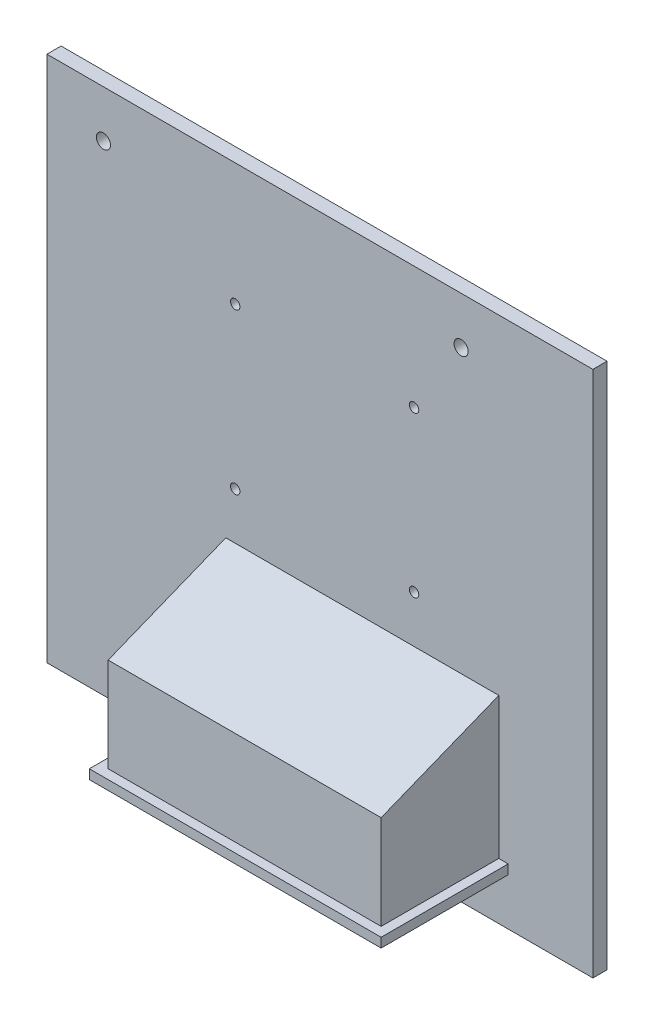
ISO-10303-21;
HEADER;
FILE_DESCRIPTION(('STEP AP214'),'2;1');
FILE_NAME('part.step','',(''),(''),'','','');
FILE_SCHEMA(('AUTOMOTIVE_DESIGN { 1 0 10303 214 1 1 1 1 }'));
ENDSEC;
DATA;
#1=APPLICATION_CONTEXT('core data for automotive mechanical design processes');
#2=APPLICATION_PROTOCOL_DEFINITION('international standard','automotive_design',2000,#1);
#3=PRODUCT_CONTEXT('',#1,'mechanical');
#4=PRODUCT('Part','Part','',(#3));
#5=PRODUCT_RELATED_PRODUCT_CATEGORY('part','',(#4));
#6=PRODUCT_DEFINITION_FORMATION('','',#4);
#7=PRODUCT_DEFINITION_CONTEXT('part definition',#1,'design');
#8=PRODUCT_DEFINITION('design','',#6,#7);
#9=PRODUCT_DEFINITION_SHAPE('','',#8);
#10=(LENGTH_UNIT() NAMED_UNIT(*) SI_UNIT(.MILLI.,.METRE.));
#11=(NAMED_UNIT(*) PLANE_ANGLE_UNIT() SI_UNIT($,.RADIAN.));
#12=(NAMED_UNIT(*) SI_UNIT($,.STERADIAN.) SOLID_ANGLE_UNIT());
#13=UNCERTAINTY_MEASURE_WITH_UNIT(LENGTH_MEASURE(1.E-05),#10,'distance_accuracy_value','');
#14=(GEOMETRIC_REPRESENTATION_CONTEXT(3) GLOBAL_UNCERTAINTY_ASSIGNED_CONTEXT((#13)) GLOBAL_UNIT_ASSIGNED_CONTEXT((#10,
#11,#12)) REPRESENTATION_CONTEXT('',''));
#15=CARTESIAN_POINT('',(0.,0.,0.));
#16=DIRECTION('',(0.,0.,1.));
#17=DIRECTION('',(1.,0.,0.));
#18=AXIS2_PLACEMENT_3D('',#15,#16,#17);
#19=CARTESIAN_POINT('',(0.,0.,3.));
#20=DIRECTION('',(0.,0.,-1.));
#21=DIRECTION('',(-1.,0.,0.));
#22=AXIS2_PLACEMENT_3D('',#19,#20,#21);
#23=PLANE('',#22);
#24=CARTESIAN_POINT('',(-36.,-46.,3.));
#25=DIRECTION('',(0.,0.,1.));
#26=DIRECTION('',(1.,0.,0.));
#27=AXIS2_PLACEMENT_3D('',#24,#25,#26);
#28=CIRCLE('',#27,1.5);
#29=CARTESIAN_POINT('',(-34.5,-46.,3.));
#30=VERTEX_POINT('',#29);
#31=EDGE_CURVE('E306',#30,#30,#28,.T.);
#32=ORIENTED_EDGE('',*,*,#31,.F.);
#33=EDGE_LOOP('',(#32));
#34=FACE_BOUND('',#33,.T.);
#35=CARTESIAN_POINT('',(-18.,30.,3.));
#36=DIRECTION('',(0.,0.,1.));
#37=DIRECTION('',(1.,0.,0.));
#38=AXIS2_PLACEMENT_3D('',#35,#36,#37);
#39=CIRCLE('',#38,1.);
#40=CARTESIAN_POINT('',(-17.,30.,3.));
#41=VERTEX_POINT('',#40);
#42=EDGE_CURVE('E307',#41,#41,#39,.T.);
#43=ORIENTED_EDGE('',*,*,#42,.F.);
#44=EDGE_LOOP('',(#43));
#45=FACE_BOUND('',#44,.T.);
#46=CARTESIAN_POINT('',(-18.,-4.,3.));
#47=DIRECTION('',(0.,0.,1.));
#48=DIRECTION('',(1.,0.,0.));
#49=AXIS2_PLACEMENT_3D('',#46,#47,#48);
#50=CIRCLE('',#49,1.);
#51=CARTESIAN_POINT('',(-17.,-4.,3.));
#52=VERTEX_POINT('',#51);
#53=EDGE_CURVE('E313',#52,#52,#50,.T.);
#54=ORIENTED_EDGE('',*,*,#53,.F.);
#55=EDGE_LOOP('',(#54));
#56=FACE_BOUND('',#55,.T.);
#57=CARTESIAN_POINT('',(20.,-4.,3.));
#58=DIRECTION('',(0.,0.,1.));
#59=DIRECTION('',(1.,0.,0.));
#60=AXIS2_PLACEMENT_3D('',#57,#58,#59);
#61=CIRCLE('',#60,1.);
#62=CARTESIAN_POINT('',(21.,-4.,3.));
#63=VERTEX_POINT('',#62);
#64=EDGE_CURVE('E281',#63,#63,#61,.T.);
#65=ORIENTED_EDGE('',*,*,#64,.F.);
#66=EDGE_LOOP('',(#65));
#67=FACE_BOUND('',#66,.T.);
#68=CARTESIAN_POINT('',(20.,30.,3.));
#69=DIRECTION('',(0.,0.,1.));
#70=DIRECTION('',(1.,0.,0.));
#71=AXIS2_PLACEMENT_3D('',#68,#69,#70);
#72=CIRCLE('',#71,1.);
#73=CARTESIAN_POINT('',(21.,30.,3.));
#74=VERTEX_POINT('',#73);
#75=EDGE_CURVE('E288',#74,#74,#72,.T.);
#76=ORIENTED_EDGE('',*,*,#75,.F.);
#77=EDGE_LOOP('',(#76));
#78=FACE_BOUND('',#77,.T.);
#79=CARTESIAN_POINT('',(30.,46.,3.));
#80=DIRECTION('',(0.,0.,1.));
#81=DIRECTION('',(1.,0.,0.));
#82=AXIS2_PLACEMENT_3D('',#79,#80,#81);
#83=CIRCLE('',#82,1.5);
#84=CARTESIAN_POINT('',(31.5,46.,3.));
#85=VERTEX_POINT('',#84);
#86=EDGE_CURVE('E294',#85,#85,#83,.T.);
#87=ORIENTED_EDGE('',*,*,#86,.F.);
#88=EDGE_LOOP('',(#87));
#89=FACE_BOUND('',#88,.T.);
#90=CARTESIAN_POINT('',(-46.,46.,3.));
#91=DIRECTION('',(0.,0.,1.));
#92=DIRECTION('',(1.,0.,0.));
#93=AXIS2_PLACEMENT_3D('',#90,#91,#92);
#94=CIRCLE('',#93,1.5);
#95=CARTESIAN_POINT('',(-44.5,46.,3.));
#96=VERTEX_POINT('',#95);
#97=EDGE_CURVE('E300',#96,#96,#94,.T.);
#98=ORIENTED_EDGE('',*,*,#97,.F.);
#99=EDGE_LOOP('',(#98));
#100=FACE_BOUND('',#99,.T.);
#101=DIRECTION('',(0.,-1.,0.));
#102=VECTOR('',#101,1.);
#103=CARTESIAN_POINT('',(-58.,-56.,3.));
#104=LINE('',#103,#102);
#105=CARTESIAN_POINT('',(-58.,56.,3.));
#106=VERTEX_POINT('',#105);
#107=CARTESIAN_POINT('',(-58.,-56.,3.));
#108=VERTEX_POINT('',#107);
#109=EDGE_CURVE('E202',#106,#108,#104,.T.);
#110=ORIENTED_EDGE('',*,*,#109,.T.);
#111=DIRECTION('',(1.,0.,0.));
#112=VECTOR('',#111,1.);
#113=CARTESIAN_POINT('',(-58.,-56.,3.));
#114=LINE('',#113,#112);
#115=CARTESIAN_POINT('',(58.,-56.,3.));
#116=VERTEX_POINT('',#115);
#117=EDGE_CURVE('E204',#108,#116,#114,.T.);
#118=ORIENTED_EDGE('',*,*,#117,.T.);
#119=DIRECTION('',(0.,1.,0.));
#120=VECTOR('',#119,1.);
#121=CARTESIAN_POINT('',(58.,-56.,3.));
#122=LINE('',#121,#120);
#123=CARTESIAN_POINT('',(58.,56.,3.));
#124=VERTEX_POINT('',#123);
#125=EDGE_CURVE('E196',#116,#124,#122,.T.);
#126=ORIENTED_EDGE('',*,*,#125,.T.);
#127=DIRECTION('',(-1.,0.,0.));
#128=VECTOR('',#127,1.);
#129=CARTESIAN_POINT('',(-58.,56.,3.));
#130=LINE('',#129,#128);
#131=EDGE_CURVE('E199',#124,#106,#130,.T.);
#132=ORIENTED_EDGE('',*,*,#131,.T.);
#133=EDGE_LOOP('',(#110,#118,#126,#132));
#134=FACE_BOUND('',#133,.T.);
#135=DIRECTION('',(1.,0.,0.));
#136=VECTOR('',#135,1.);
#137=CARTESIAN_POINT('',(-22.,-44.,3.));
#138=LINE('',#137,#136);
#139=CARTESIAN_POINT('',(38.,-44.,3.));
#140=VERTEX_POINT('',#139);
#141=CARTESIAN_POINT('',(40.,-44.,3.));
#142=VERTEX_POINT('',#141);
#143=EDGE_CURVE('E259',#140,#142,#138,.T.);
#144=ORIENTED_EDGE('',*,*,#143,.T.);
#145=DIRECTION('',(0.,-1.,0.));
#146=VECTOR('',#145,1.);
#147=CARTESIAN_POINT('',(40.,-44.,3.));
#148=LINE('',#147,#146);
#149=CARTESIAN_POINT('',(40.,-46.,3.));
#150=VERTEX_POINT('',#149);
#151=EDGE_CURVE('E247',#142,#150,#148,.T.);
#152=ORIENTED_EDGE('',*,*,#151,.T.);
#153=DIRECTION('',(1.,0.,0.));
#154=VECTOR('',#153,1.);
#155=CARTESIAN_POINT('',(-22.,-46.,3.));
#156=LINE('',#155,#154);
#157=CARTESIAN_POINT('',(38.,-46.,3.));
#158=VERTEX_POINT('',#157);
#159=EDGE_CURVE('E268',#158,#150,#156,.T.);
#160=ORIENTED_EDGE('',*,*,#159,.F.);
#161=DIRECTION('',(0.,1.,0.));
#162=VECTOR('',#161,1.);
#163=CARTESIAN_POINT('',(38.,-48.,3.));
#164=LINE('',#163,#162);
#165=CARTESIAN_POINT('',(38.,-48.,3.));
#166=VERTEX_POINT('',#165);
#167=EDGE_CURVE('E182',#166,#158,#164,.T.);
#168=ORIENTED_EDGE('',*,*,#167,.F.);
#169=DIRECTION('',(1.,0.,0.));
#170=VECTOR('',#169,1.);
#171=CARTESIAN_POINT('',(-20.,-48.,3.));
#172=LINE('',#171,#170);
#173=CARTESIAN_POINT('',(-20.,-48.,3.));
#174=VERTEX_POINT('',#173);
#175=EDGE_CURVE('E166',#174,#166,#172,.T.);
#176=ORIENTED_EDGE('',*,*,#175,.F.);
#177=DIRECTION('',(0.,-1.,0.));
#178=VECTOR('',#177,1.);
#179=CARTESIAN_POINT('',(-20.,-48.,3.));
#180=LINE('',#179,#178);
#181=CARTESIAN_POINT('',(-20.,-46.,3.));
#182=VERTEX_POINT('',#181);
#183=EDGE_CURVE('E187',#182,#174,#180,.T.);
#184=ORIENTED_EDGE('',*,*,#183,.F.);
#185=CARTESIAN_POINT('',(-22.,-46.,3.));
#186=VERTEX_POINT('',#185);
#187=EDGE_CURVE('E266',#186,#182,#156,.T.);
#188=ORIENTED_EDGE('',*,*,#187,.F.);
#189=DIRECTION('',(0.,-1.,0.));
#190=VECTOR('',#189,1.);
#191=CARTESIAN_POINT('',(-22.,-44.,3.));
#192=LINE('',#191,#190);
#193=CARTESIAN_POINT('',(-22.,-44.,3.));
#194=VERTEX_POINT('',#193);
#195=EDGE_CURVE('E244',#194,#186,#192,.T.);
#196=ORIENTED_EDGE('',*,*,#195,.F.);
#197=CARTESIAN_POINT('',(-20.,-44.,3.));
#198=VERTEX_POINT('',#197);
#199=EDGE_CURVE('E277',#194,#198,#138,.T.);
#200=ORIENTED_EDGE('',*,*,#199,.T.);
#201=CARTESIAN_POINT('',(-20.,-14.,3.));
#202=VERTEX_POINT('',#201);
#203=EDGE_CURVE('E171',#202,#198,#180,.T.);
#204=ORIENTED_EDGE('',*,*,#203,.F.);
#205=DIRECTION('',(-1.,0.,0.));
#206=VECTOR('',#205,1.);
#207=CARTESIAN_POINT('',(-20.,-14.,3.));
#208=LINE('',#207,#206);
#209=CARTESIAN_POINT('',(38.,-14.,3.));
#210=VERTEX_POINT('',#209);
#211=EDGE_CURVE('E185',#210,#202,#208,.T.);
#212=ORIENTED_EDGE('',*,*,#211,.F.);
#213=EDGE_CURVE('E159',#140,#210,#164,.T.);
#214=ORIENTED_EDGE('',*,*,#213,.F.);
#215=EDGE_LOOP('',(#144,#152,#160,#168,#176,#184,#188,#196,#200,#204,#212,#214));
#216=FACE_BOUND('',#215,.T.);
#217=ADVANCED_FACE('F34',(#34,#45,#56,#67,#78,#89,#100,#134,#216),#23,.F.);
#218=CARTESIAN_POINT('',(38.,-48.,28.));
#219=DIRECTION('',(-1.,0.,0.));
#220=DIRECTION('',(0.,0.,1.));
#221=AXIS2_PLACEMENT_3D('',#218,#219,#220);
#222=PLANE('',#221);
#223=ORIENTED_EDGE('',*,*,#213,.T.);
#224=DIRECTION('',(0.,0.371405845234205,-0.928470623189482));
#225=VECTOR('',#224,1.);
#226=CARTESIAN_POINT('',(38.,-14.,3.));
#227=LINE('',#226,#225);
#228=CARTESIAN_POINT('',(38.,-24.0004737887762,28.));
#229=VERTEX_POINT('',#228);
#230=EDGE_CURVE('E57',#229,#210,#227,.T.);
#231=ORIENTED_EDGE('',*,*,#230,.F.);
#232=DIRECTION('',(0.,1.,0.));
#233=VECTOR('',#232,1.);
#234=CARTESIAN_POINT('',(38.,-48.,28.));
#235=LINE('',#234,#233);
#236=CARTESIAN_POINT('',(38.,-44.,28.));
#237=VERTEX_POINT('',#236);
#238=EDGE_CURVE('E157',#237,#229,#235,.T.);
#239=ORIENTED_EDGE('',*,*,#238,.F.);
#240=DIRECTION('',(0.,0.,1.));
#241=VECTOR('',#240,1.);
#242=CARTESIAN_POINT('',(38.,-44.,28.));
#243=LINE('',#242,#241);
#244=EDGE_CURVE('E175',#140,#237,#243,.T.);
#245=ORIENTED_EDGE('',*,*,#244,.F.);
#246=EDGE_LOOP('',(#223,#231,#239,#245));
#247=FACE_BOUND('',#246,.T.);
#248=ADVANCED_FACE('F155',(#247),#222,.F.);
#249=CARTESIAN_POINT('',(-20.,-48.,28.));
#250=DIRECTION('',(1.,0.,0.));
#251=DIRECTION('',(0.,0.,-1.));
#252=AXIS2_PLACEMENT_3D('',#249,#250,#251);
#253=PLANE('',#252);
#254=DIRECTION('',(0.,-1.,0.));
#255=VECTOR('',#254,1.);
#256=CARTESIAN_POINT('',(-20.,-48.,28.));
#257=LINE('',#256,#255);
#258=CARTESIAN_POINT('',(-20.,-24.0004737887762,28.));
#259=VERTEX_POINT('',#258);
#260=CARTESIAN_POINT('',(-20.,-44.,28.));
#261=VERTEX_POINT('',#260);
#262=EDGE_CURVE('E177',#259,#261,#257,.T.);
#263=ORIENTED_EDGE('',*,*,#262,.F.);
#264=DIRECTION('',(0.,0.371405845234205,-0.928470623189483));
#265=VECTOR('',#264,1.);
#266=CARTESIAN_POINT('',(-20.,-27.311023678241,36.2759826168945));
#267=LINE('',#266,#265);
#268=EDGE_CURVE('E148',#259,#202,#267,.T.);
#269=ORIENTED_EDGE('',*,*,#268,.T.);
#270=ORIENTED_EDGE('',*,*,#203,.T.);
#271=DIRECTION('',(0.,0.,-1.));
#272=VECTOR('',#271,1.);
#273=CARTESIAN_POINT('',(-20.,-44.,28.));
#274=LINE('',#273,#272);
#275=EDGE_CURVE('E242',#261,#198,#274,.T.);
#276=ORIENTED_EDGE('',*,*,#275,.F.);
#277=EDGE_LOOP('',(#263,#269,#270,#276));
#278=FACE_BOUND('',#277,.T.);
#279=ADVANCED_FACE('F370',(#278),#253,.F.);
#280=CARTESIAN_POINT('',(0.,0.,28.));
#281=DIRECTION('',(0.,0.,-1.));
#282=DIRECTION('',(-1.,0.,0.));
#283=AXIS2_PLACEMENT_3D('',#280,#281,#282);
#284=PLANE('',#283);
#285=ORIENTED_EDGE('',*,*,#238,.T.);
#286=DIRECTION('',(1.,0.,0.));
#287=VECTOR('',#286,1.);
#288=CARTESIAN_POINT('',(-58.,-24.0004737887762,28.));
#289=LINE('',#288,#287);
#290=EDGE_CURVE('E145',#259,#229,#289,.T.);
#291=ORIENTED_EDGE('',*,*,#290,.F.);
#292=ORIENTED_EDGE('',*,*,#262,.T.);
#293=DIRECTION('',(-1.,0.,0.));
#294=VECTOR('',#293,1.);
#295=CARTESIAN_POINT('',(0.,-44.,28.));
#296=LINE('',#295,#294);
#297=EDGE_CURVE('E11',#237,#261,#296,.T.);
#298=ORIENTED_EDGE('',*,*,#297,.F.);
#299=EDGE_LOOP('',(#285,#291,#292,#298));
#300=FACE_BOUND('',#299,.T.);
#301=ADVANCED_FACE('F164',(#300),#284,.F.);
#302=CARTESIAN_POINT('',(58.,-56.,3.));
#303=DIRECTION('',(-1.,0.,0.));
#304=DIRECTION('',(0.,0.,1.));
#305=AXIS2_PLACEMENT_3D('',#302,#303,#304);
#306=PLANE('',#305);
#307=DIRECTION('',(0.,1.,0.));
#308=VECTOR('',#307,1.);
#309=CARTESIAN_POINT('',(58.,-56.,0.));
#310=LINE('',#309,#308);
#311=CARTESIAN_POINT('',(58.,-56.,0.));
#312=VERTEX_POINT('',#311);
#313=CARTESIAN_POINT('',(58.,56.,0.));
#314=VERTEX_POINT('',#313);
#315=EDGE_CURVE('E195',#312,#314,#310,.T.);
#316=ORIENTED_EDGE('',*,*,#315,.T.);
#317=DIRECTION('',(0.,0.,-1.));
#318=VECTOR('',#317,1.);
#319=CARTESIAN_POINT('',(58.,56.,3.));
#320=LINE('',#319,#318);
#321=EDGE_CURVE('E222',#124,#314,#320,.T.);
#322=ORIENTED_EDGE('',*,*,#321,.F.);
#323=ORIENTED_EDGE('',*,*,#125,.F.);
#324=DIRECTION('',(0.,0.,-1.));
#325=VECTOR('',#324,1.);
#326=CARTESIAN_POINT('',(58.,-56.,3.));
#327=LINE('',#326,#325);
#328=EDGE_CURVE('E206',#116,#312,#327,.T.);
#329=ORIENTED_EDGE('',*,*,#328,.T.);
#330=EDGE_LOOP('',(#316,#322,#323,#329));
#331=FACE_BOUND('',#330,.T.);
#332=ADVANCED_FACE('F36',(#331),#306,.F.);
#333=CARTESIAN_POINT('',(-58.,56.,3.));
#334=DIRECTION('',(0.,-1.,0.));
#335=DIRECTION('',(0.,0.,-1.));
#336=AXIS2_PLACEMENT_3D('',#333,#334,#335);
#337=PLANE('',#336);
#338=DIRECTION('',(-1.,0.,0.));
#339=VECTOR('',#338,1.);
#340=CARTESIAN_POINT('',(-58.,56.,0.));
#341=LINE('',#340,#339);
#342=CARTESIAN_POINT('',(-58.,56.,0.));
#343=VERTEX_POINT('',#342);
#344=EDGE_CURVE('E209',#314,#343,#341,.T.);
#345=ORIENTED_EDGE('',*,*,#344,.T.);
#346=DIRECTION('',(0.,0.,-1.));
#347=VECTOR('',#346,1.);
#348=CARTESIAN_POINT('',(-58.,56.,3.));
#349=LINE('',#348,#347);
#350=EDGE_CURVE('E219',#106,#343,#349,.T.);
#351=ORIENTED_EDGE('',*,*,#350,.F.);
#352=ORIENTED_EDGE('',*,*,#131,.F.);
#353=ORIENTED_EDGE('',*,*,#321,.T.);
#354=EDGE_LOOP('',(#345,#351,#352,#353));
#355=FACE_BOUND('',#354,.T.);
#356=ADVANCED_FACE('F396',(#355),#337,.F.);
#357=CARTESIAN_POINT('',(-58.,-56.,3.));
#358=DIRECTION('',(1.,0.,0.));
#359=DIRECTION('',(0.,0.,-1.));
#360=AXIS2_PLACEMENT_3D('',#357,#358,#359);
#361=PLANE('',#360);
#362=DIRECTION('',(0.,-1.,0.));
#363=VECTOR('',#362,1.);
#364=CARTESIAN_POINT('',(-58.,-56.,0.));
#365=LINE('',#364,#363);
#366=CARTESIAN_POINT('',(-58.,-56.,0.));
#367=VERTEX_POINT('',#366);
#368=EDGE_CURVE('E211',#343,#367,#365,.T.);
#369=ORIENTED_EDGE('',*,*,#368,.T.);
#370=DIRECTION('',(0.,0.,-1.));
#371=VECTOR('',#370,1.);
#372=CARTESIAN_POINT('',(-58.,-56.,3.));
#373=LINE('',#372,#371);
#374=EDGE_CURVE('E216',#108,#367,#373,.T.);
#375=ORIENTED_EDGE('',*,*,#374,.F.);
#376=ORIENTED_EDGE('',*,*,#109,.F.);
#377=ORIENTED_EDGE('',*,*,#350,.T.);
#378=EDGE_LOOP('',(#369,#375,#376,#377));
#379=FACE_BOUND('',#378,.T.);
#380=ADVANCED_FACE('F393',(#379),#361,.F.);
#381=CARTESIAN_POINT('',(-58.,-56.,3.));
#382=DIRECTION('',(0.,1.,0.));
#383=DIRECTION('',(0.,0.,1.));
#384=AXIS2_PLACEMENT_3D('',#381,#382,#383);
#385=PLANE('',#384);
#386=DIRECTION('',(1.,0.,0.));
#387=VECTOR('',#386,1.);
#388=CARTESIAN_POINT('',(-58.,-56.,0.));
#389=LINE('',#388,#387);
#390=EDGE_CURVE('E200',#367,#312,#389,.T.);
#391=ORIENTED_EDGE('',*,*,#390,.T.);
#392=ORIENTED_EDGE('',*,*,#328,.F.);
#393=ORIENTED_EDGE('',*,*,#117,.F.);
#394=ORIENTED_EDGE('',*,*,#374,.T.);
#395=EDGE_LOOP('',(#391,#392,#393,#394));
#396=FACE_BOUND('',#395,.T.);
#397=ADVANCED_FACE('F388',(#396),#385,.F.);
#398=CARTESIAN_POINT('',(0.,0.,0.));
#399=DIRECTION('',(0.,0.,-1.));
#400=DIRECTION('',(-1.,0.,0.));
#401=AXIS2_PLACEMENT_3D('',#398,#399,#400);
#402=PLANE('',#401);
#403=CARTESIAN_POINT('',(-36.,-46.,0.));
#404=DIRECTION('',(0.,0.,1.));
#405=DIRECTION('',(1.,0.,0.));
#406=AXIS2_PLACEMENT_3D('',#403,#404,#405);
#407=CIRCLE('',#406,1.5);
#408=CARTESIAN_POINT('',(-34.5,-46.,0.));
#409=VERTEX_POINT('',#408);
#410=EDGE_CURVE('E161',#409,#409,#407,.T.);
#411=ORIENTED_EDGE('',*,*,#410,.T.);
#412=EDGE_LOOP('',(#411));
#413=FACE_BOUND('',#412,.T.);
#414=CARTESIAN_POINT('',(-18.,30.,0.));
#415=DIRECTION('',(0.,0.,1.));
#416=DIRECTION('',(1.,0.,0.));
#417=AXIS2_PLACEMENT_3D('',#414,#415,#416);
#418=CIRCLE('',#417,1.);
#419=CARTESIAN_POINT('',(-17.,30.,0.));
#420=VERTEX_POINT('',#419);
#421=EDGE_CURVE('E310',#420,#420,#418,.T.);
#422=ORIENTED_EDGE('',*,*,#421,.T.);
#423=EDGE_LOOP('',(#422));
#424=FACE_BOUND('',#423,.T.);
#425=CARTESIAN_POINT('',(-18.,-4.,0.));
#426=DIRECTION('',(0.,0.,1.));
#427=DIRECTION('',(1.,0.,0.));
#428=AXIS2_PLACEMENT_3D('',#425,#426,#427);
#429=CIRCLE('',#428,1.);
#430=CARTESIAN_POINT('',(-17.,-4.,0.));
#431=VERTEX_POINT('',#430);
#432=EDGE_CURVE('E285',#431,#431,#429,.T.);
#433=ORIENTED_EDGE('',*,*,#432,.T.);
#434=EDGE_LOOP('',(#433));
#435=FACE_BOUND('',#434,.T.);
#436=CARTESIAN_POINT('',(20.,-4.,0.));
#437=DIRECTION('',(0.,0.,1.));
#438=DIRECTION('',(1.,0.,0.));
#439=AXIS2_PLACEMENT_3D('',#436,#437,#438);
#440=CIRCLE('',#439,1.);
#441=CARTESIAN_POINT('',(21.,-4.,0.));
#442=VERTEX_POINT('',#441);
#443=EDGE_CURVE('E284',#442,#442,#440,.T.);
#444=ORIENTED_EDGE('',*,*,#443,.T.);
#445=EDGE_LOOP('',(#444));
#446=FACE_BOUND('',#445,.T.);
#447=CARTESIAN_POINT('',(20.,30.,0.));
#448=DIRECTION('',(0.,0.,1.));
#449=DIRECTION('',(1.,0.,0.));
#450=AXIS2_PLACEMENT_3D('',#447,#448,#449);
#451=CIRCLE('',#450,1.);
#452=CARTESIAN_POINT('',(21.,30.,0.));
#453=VERTEX_POINT('',#452);
#454=EDGE_CURVE('E291',#453,#453,#451,.T.);
#455=ORIENTED_EDGE('',*,*,#454,.T.);
#456=EDGE_LOOP('',(#455));
#457=FACE_BOUND('',#456,.T.);
#458=CARTESIAN_POINT('',(30.,46.,0.));
#459=DIRECTION('',(0.,0.,1.));
#460=DIRECTION('',(1.,0.,0.));
#461=AXIS2_PLACEMENT_3D('',#458,#459,#460);
#462=CIRCLE('',#461,1.5);
#463=CARTESIAN_POINT('',(31.5,46.,0.));
#464=VERTEX_POINT('',#463);
#465=EDGE_CURVE('E297',#464,#464,#462,.T.);
#466=ORIENTED_EDGE('',*,*,#465,.T.);
#467=EDGE_LOOP('',(#466));
#468=FACE_BOUND('',#467,.T.);
#469=CARTESIAN_POINT('',(-46.,46.,0.));
#470=DIRECTION('',(0.,0.,1.));
#471=DIRECTION('',(1.,0.,0.));
#472=AXIS2_PLACEMENT_3D('',#469,#470,#471);
#473=CIRCLE('',#472,1.5);
#474=CARTESIAN_POINT('',(-44.5,46.,0.));
#475=VERTEX_POINT('',#474);
#476=EDGE_CURVE('E303',#475,#475,#473,.T.);
#477=ORIENTED_EDGE('',*,*,#476,.T.);
#478=EDGE_LOOP('',(#477));
#479=FACE_BOUND('',#478,.T.);
#480=ORIENTED_EDGE('',*,*,#315,.F.);
#481=ORIENTED_EDGE('',*,*,#390,.F.);
#482=ORIENTED_EDGE('',*,*,#368,.F.);
#483=ORIENTED_EDGE('',*,*,#344,.F.);
#484=EDGE_LOOP('',(#480,#481,#482,#483));
#485=FACE_BOUND('',#484,.T.);
#486=ADVANCED_FACE('F323',(#413,#424,#435,#446,#457,#468,#479,#485),#402,.T.);
#487=ORIENTED_EDGE('',*,*,#167,.T.);
#488=DIRECTION('',(0.,0.,1.));
#489=VECTOR('',#488,1.);
#490=CARTESIAN_POINT('',(38.,-46.,28.));
#491=LINE('',#490,#489);
#492=CARTESIAN_POINT('',(38.,-46.,28.));
#493=VERTEX_POINT('',#492);
#494=EDGE_CURVE('E240',#158,#493,#491,.T.);
#495=ORIENTED_EDGE('',*,*,#494,.T.);
#496=CARTESIAN_POINT('',(38.,-48.,28.));
#497=VERTEX_POINT('',#496);
#498=EDGE_CURVE('E165',#497,#493,#235,.T.);
#499=ORIENTED_EDGE('',*,*,#498,.F.);
#500=DIRECTION('',(0.,0.,-1.));
#501=VECTOR('',#500,1.);
#502=CARTESIAN_POINT('',(38.,-48.,28.));
#503=LINE('',#502,#501);
#504=EDGE_CURVE('E181',#497,#166,#503,.T.);
#505=ORIENTED_EDGE('',*,*,#504,.T.);
#506=EDGE_LOOP('',(#487,#495,#499,#505));
#507=FACE_BOUND('',#506,.T.);
#508=ADVANCED_FACE('F239',(#507),#222,.F.);
#509=CARTESIAN_POINT('',(-20.,-46.,28.));
#510=VERTEX_POINT('',#509);
#511=CARTESIAN_POINT('',(-20.,-48.,28.));
#512=VERTEX_POINT('',#511);
#513=EDGE_CURVE('E169',#510,#512,#257,.T.);
#514=ORIENTED_EDGE('',*,*,#513,.F.);
#515=DIRECTION('',(0.,0.,-1.));
#516=VECTOR('',#515,1.);
#517=CARTESIAN_POINT('',(-20.,-46.,28.));
#518=LINE('',#517,#516);
#519=EDGE_CURVE('E49',#510,#182,#518,.T.);
#520=ORIENTED_EDGE('',*,*,#519,.T.);
#521=ORIENTED_EDGE('',*,*,#183,.T.);
#522=DIRECTION('',(0.,0.,-1.));
#523=VECTOR('',#522,1.);
#524=CARTESIAN_POINT('',(-20.,-48.,28.));
#525=LINE('',#524,#523);
#526=EDGE_CURVE('E192',#512,#174,#525,.T.);
#527=ORIENTED_EDGE('',*,*,#526,.F.);
#528=EDGE_LOOP('',(#514,#520,#521,#527));
#529=FACE_BOUND('',#528,.T.);
#530=ADVANCED_FACE('F231',(#529),#253,.F.);
#531=CARTESIAN_POINT('',(-20.,-48.,28.));
#532=DIRECTION('',(0.,1.,0.));
#533=DIRECTION('',(0.,0.,1.));
#534=AXIS2_PLACEMENT_3D('',#531,#532,#533);
#535=PLANE('',#534);
#536=ORIENTED_EDGE('',*,*,#175,.T.);
#537=ORIENTED_EDGE('',*,*,#504,.F.);
#538=DIRECTION('',(1.,0.,0.));
#539=VECTOR('',#538,1.);
#540=CARTESIAN_POINT('',(-20.,-48.,28.));
#541=LINE('',#540,#539);
#542=EDGE_CURVE('E179',#512,#497,#541,.T.);
#543=ORIENTED_EDGE('',*,*,#542,.F.);
#544=ORIENTED_EDGE('',*,*,#526,.T.);
#545=EDGE_LOOP('',(#536,#537,#543,#544));
#546=FACE_BOUND('',#545,.T.);
#547=ADVANCED_FACE('F237',(#546),#535,.F.);
#548=ORIENTED_EDGE('',*,*,#498,.T.);
#549=DIRECTION('',(-1.,0.,0.));
#550=VECTOR('',#549,1.);
#551=CARTESIAN_POINT('',(0.,-46.,28.));
#552=LINE('',#551,#550);
#553=EDGE_CURVE('E42',#493,#510,#552,.T.);
#554=ORIENTED_EDGE('',*,*,#553,.T.);
#555=ORIENTED_EDGE('',*,*,#513,.T.);
#556=ORIENTED_EDGE('',*,*,#542,.T.);
#557=EDGE_LOOP('',(#548,#554,#555,#556));
#558=FACE_BOUND('',#557,.T.);
#559=ADVANCED_FACE('F226',(#558),#284,.F.);
#560=CARTESIAN_POINT('',(0.,-44.,0.));
#561=DIRECTION('',(0.,-1.,0.));
#562=DIRECTION('',(0.,0.,-1.));
#563=AXIS2_PLACEMENT_3D('',#560,#561,#562);
#564=PLANE('',#563);
#565=ORIENTED_EDGE('',*,*,#143,.F.);
#566=ORIENTED_EDGE('',*,*,#244,.T.);
#567=ORIENTED_EDGE('',*,*,#297,.T.);
#568=ORIENTED_EDGE('',*,*,#275,.T.);
#569=ORIENTED_EDGE('',*,*,#199,.F.);
#570=DIRECTION('',(0.,0.,-1.));
#571=VECTOR('',#570,1.);
#572=CARTESIAN_POINT('',(-22.,-44.,30.));
#573=LINE('',#572,#571);
#574=CARTESIAN_POINT('',(-22.,-44.,30.));
#575=VERTEX_POINT('',#574);
#576=EDGE_CURVE('E251',#575,#194,#573,.T.);
#577=ORIENTED_EDGE('',*,*,#576,.F.);
#578=DIRECTION('',(-1.,0.,0.));
#579=VECTOR('',#578,1.);
#580=CARTESIAN_POINT('',(40.,-44.,30.));
#581=LINE('',#580,#579);
#582=CARTESIAN_POINT('',(40.,-44.,30.));
#583=VERTEX_POINT('',#582);
#584=EDGE_CURVE('E271',#583,#575,#581,.T.);
#585=ORIENTED_EDGE('',*,*,#584,.F.);
#586=DIRECTION('',(0.,0.,1.));
#587=VECTOR('',#586,1.);
#588=CARTESIAN_POINT('',(40.,-44.,3.));
#589=LINE('',#588,#587);
#590=EDGE_CURVE('E274',#142,#583,#589,.T.);
#591=ORIENTED_EDGE('',*,*,#590,.F.);
#592=EDGE_LOOP('',(#565,#566,#567,#568,#569,#577,#585,#591));
#593=FACE_BOUND('',#592,.T.);
#594=ADVANCED_FACE('F354',(#593),#564,.F.);
#595=CARTESIAN_POINT('',(0.,-46.,0.));
#596=DIRECTION('',(0.,-1.,0.));
#597=DIRECTION('',(0.,0.,-1.));
#598=AXIS2_PLACEMENT_3D('',#595,#596,#597);
#599=PLANE('',#598);
#600=ORIENTED_EDGE('',*,*,#494,.F.);
#601=ORIENTED_EDGE('',*,*,#159,.T.);
#602=DIRECTION('',(0.,0.,1.));
#603=VECTOR('',#602,1.);
#604=CARTESIAN_POINT('',(40.,-46.,3.));
#605=LINE('',#604,#603);
#606=CARTESIAN_POINT('',(40.,-46.,30.));
#607=VERTEX_POINT('',#606);
#608=EDGE_CURVE('E263',#150,#607,#605,.T.);
#609=ORIENTED_EDGE('',*,*,#608,.T.);
#610=DIRECTION('',(-1.,0.,0.));
#611=VECTOR('',#610,1.);
#612=CARTESIAN_POINT('',(40.,-46.,30.));
#613=LINE('',#612,#611);
#614=CARTESIAN_POINT('',(-22.,-46.,30.));
#615=VERTEX_POINT('',#614);
#616=EDGE_CURVE('E260',#607,#615,#613,.T.);
#617=ORIENTED_EDGE('',*,*,#616,.T.);
#618=DIRECTION('',(0.,0.,-1.));
#619=VECTOR('',#618,1.);
#620=CARTESIAN_POINT('',(-22.,-46.,30.));
#621=LINE('',#620,#619);
#622=EDGE_CURVE('E256',#615,#186,#621,.T.);
#623=ORIENTED_EDGE('',*,*,#622,.T.);
#624=ORIENTED_EDGE('',*,*,#187,.T.);
#625=ORIENTED_EDGE('',*,*,#519,.F.);
#626=ORIENTED_EDGE('',*,*,#553,.F.);
#627=EDGE_LOOP('',(#600,#601,#609,#617,#623,#624,#625,#626));
#628=FACE_BOUND('',#627,.T.);
#629=ADVANCED_FACE('F361',(#628),#599,.T.);
#630=CARTESIAN_POINT('',(-22.,-44.,30.));
#631=DIRECTION('',(-1.,0.,0.));
#632=DIRECTION('',(0.,0.,1.));
#633=AXIS2_PLACEMENT_3D('',#630,#631,#632);
#634=PLANE('',#633);
#635=ORIENTED_EDGE('',*,*,#622,.F.);
#636=DIRECTION('',(0.,-1.,0.));
#637=VECTOR('',#636,1.);
#638=CARTESIAN_POINT('',(-22.,-44.,30.));
#639=LINE('',#638,#637);
#640=EDGE_CURVE('E253',#575,#615,#639,.T.);
#641=ORIENTED_EDGE('',*,*,#640,.F.);
#642=ORIENTED_EDGE('',*,*,#576,.T.);
#643=ORIENTED_EDGE('',*,*,#195,.T.);
#644=EDGE_LOOP('',(#635,#641,#642,#643));
#645=FACE_BOUND('',#644,.T.);
#646=ADVANCED_FACE('F366',(#645),#634,.T.);
#647=CARTESIAN_POINT('',(40.,-44.,30.));
#648=DIRECTION('',(0.,0.,1.));
#649=DIRECTION('',(1.,0.,0.));
#650=AXIS2_PLACEMENT_3D('',#647,#648,#649);
#651=PLANE('',#650);
#652=ORIENTED_EDGE('',*,*,#616,.F.);
#653=DIRECTION('',(0.,-1.,0.));
#654=VECTOR('',#653,1.);
#655=CARTESIAN_POINT('',(40.,-44.,30.));
#656=LINE('',#655,#654);
#657=EDGE_CURVE('E250',#583,#607,#656,.T.);
#658=ORIENTED_EDGE('',*,*,#657,.F.);
#659=ORIENTED_EDGE('',*,*,#584,.T.);
#660=ORIENTED_EDGE('',*,*,#640,.T.);
#661=EDGE_LOOP('',(#652,#658,#659,#660));
#662=FACE_BOUND('',#661,.T.);
#663=ADVANCED_FACE('F534',(#662),#651,.T.);
#664=CARTESIAN_POINT('',(40.,-44.,3.));
#665=DIRECTION('',(1.,0.,0.));
#666=DIRECTION('',(0.,0.,-1.));
#667=AXIS2_PLACEMENT_3D('',#664,#665,#666);
#668=PLANE('',#667);
#669=ORIENTED_EDGE('',*,*,#608,.F.);
#670=ORIENTED_EDGE('',*,*,#151,.F.);
#671=ORIENTED_EDGE('',*,*,#590,.T.);
#672=ORIENTED_EDGE('',*,*,#657,.T.);
#673=EDGE_LOOP('',(#669,#670,#671,#672));
#674=FACE_BOUND('',#673,.T.);
#675=ADVANCED_FACE('F359',(#674),#668,.T.);
#676=CARTESIAN_POINT('',(-58.,-14.,3.));
#677=DIRECTION('',(0.,-0.928470623189483,-0.371405845234205));
#678=DIRECTION('',(0.,0.371405845234205,-0.928470623189483));
#679=AXIS2_PLACEMENT_3D('',#676,#677,#678);
#680=PLANE('',#679);
#681=ORIENTED_EDGE('',*,*,#290,.T.);
#682=ORIENTED_EDGE('',*,*,#230,.T.);
#683=ORIENTED_EDGE('',*,*,#211,.T.);
#684=ORIENTED_EDGE('',*,*,#268,.F.);
#685=EDGE_LOOP('',(#681,#682,#683,#684));
#686=FACE_BOUND('',#685,.T.);
#687=ADVANCED_FACE('F146',(#686),#680,.F.);
#688=CARTESIAN_POINT('',(-46.,46.,0.));
#689=DIRECTION('',(0.,0.,1.));
#690=DIRECTION('',(1.,0.,0.));
#691=AXIS2_PLACEMENT_3D('',#688,#689,#690);
#692=CYLINDRICAL_SURFACE('',#691,1.5);
#693=ORIENTED_EDGE('',*,*,#476,.F.);
#694=EDGE_LOOP('',(#693));
#695=FACE_BOUND('',#694,.T.);
#696=ORIENTED_EDGE('',*,*,#97,.T.);
#697=EDGE_LOOP('',(#696));
#698=FACE_BOUND('',#697,.T.);
#699=ADVANCED_FACE('F440',(#695,#698),#692,.F.);
#700=CARTESIAN_POINT('',(30.,46.,0.));
#701=DIRECTION('',(0.,0.,1.));
#702=DIRECTION('',(1.,0.,0.));
#703=AXIS2_PLACEMENT_3D('',#700,#701,#702);
#704=CYLINDRICAL_SURFACE('',#703,1.5);
#705=ORIENTED_EDGE('',*,*,#465,.F.);
#706=EDGE_LOOP('',(#705));
#707=FACE_BOUND('',#706,.T.);
#708=ORIENTED_EDGE('',*,*,#86,.T.);
#709=EDGE_LOOP('',(#708));
#710=FACE_BOUND('',#709,.T.);
#711=ADVANCED_FACE('F466',(#707,#710),#704,.F.);
#712=CARTESIAN_POINT('',(20.,30.,0.));
#713=DIRECTION('',(0.,0.,1.));
#714=DIRECTION('',(1.,0.,0.));
#715=AXIS2_PLACEMENT_3D('',#712,#713,#714);
#716=CYLINDRICAL_SURFACE('',#715,1.);
#717=ORIENTED_EDGE('',*,*,#454,.F.);
#718=EDGE_LOOP('',(#717));
#719=FACE_BOUND('',#718,.T.);
#720=ORIENTED_EDGE('',*,*,#75,.T.);
#721=EDGE_LOOP('',(#720));
#722=FACE_BOUND('',#721,.T.);
#723=ADVANCED_FACE('F476',(#719,#722),#716,.F.);
#724=CARTESIAN_POINT('',(20.,-4.,0.));
#725=DIRECTION('',(0.,0.,1.));
#726=DIRECTION('',(1.,0.,0.));
#727=AXIS2_PLACEMENT_3D('',#724,#725,#726);
#728=CYLINDRICAL_SURFACE('',#727,1.);
#729=ORIENTED_EDGE('',*,*,#443,.F.);
#730=EDGE_LOOP('',(#729));
#731=FACE_BOUND('',#730,.T.);
#732=ORIENTED_EDGE('',*,*,#64,.T.);
#733=EDGE_LOOP('',(#732));
#734=FACE_BOUND('',#733,.T.);
#735=ADVANCED_FACE('F486',(#731,#734),#728,.F.);
#736=CARTESIAN_POINT('',(-18.,-4.,0.));
#737=DIRECTION('',(0.,0.,1.));
#738=DIRECTION('',(1.,0.,0.));
#739=AXIS2_PLACEMENT_3D('',#736,#737,#738);
#740=CYLINDRICAL_SURFACE('',#739,1.);
#741=ORIENTED_EDGE('',*,*,#432,.F.);
#742=EDGE_LOOP('',(#741));
#743=FACE_BOUND('',#742,.T.);
#744=ORIENTED_EDGE('',*,*,#53,.T.);
#745=EDGE_LOOP('',(#744));
#746=FACE_BOUND('',#745,.T.);
#747=ADVANCED_FACE('F496',(#743,#746),#740,.F.);
#748=CARTESIAN_POINT('',(-18.,30.,0.));
#749=DIRECTION('',(0.,0.,1.));
#750=DIRECTION('',(1.,0.,0.));
#751=AXIS2_PLACEMENT_3D('',#748,#749,#750);
#752=CYLINDRICAL_SURFACE('',#751,1.);
#753=ORIENTED_EDGE('',*,*,#421,.F.);
#754=EDGE_LOOP('',(#753));
#755=FACE_BOUND('',#754,.T.);
#756=ORIENTED_EDGE('',*,*,#42,.T.);
#757=EDGE_LOOP('',(#756));
#758=FACE_BOUND('',#757,.T.);
#759=ADVANCED_FACE('F329',(#755,#758),#752,.F.);
#760=CARTESIAN_POINT('',(-36.,-46.,0.));
#761=DIRECTION('',(0.,0.,1.));
#762=DIRECTION('',(1.,0.,0.));
#763=AXIS2_PLACEMENT_3D('',#760,#761,#762);
#764=CYLINDRICAL_SURFACE('',#763,1.5);
#765=ORIENTED_EDGE('',*,*,#410,.F.);
#766=EDGE_LOOP('',(#765));
#767=FACE_BOUND('',#766,.T.);
#768=ORIENTED_EDGE('',*,*,#31,.T.);
#769=EDGE_LOOP('',(#768));
#770=FACE_BOUND('',#769,.T.);
#771=ADVANCED_FACE('F326',(#767,#770),#764,.F.);
#772=CLOSED_SHELL('',(#217,#248,#279,#301,#332,#356,#380,#397,#486,#508,#530,#547,#559,#594,
#629,#646,#663,#675,#687,#699,#711,#723,#735,#747,#759,#771));
#773=MANIFOLD_SOLID_BREP('B2',#772);
#774=ADVANCED_BREP_SHAPE_REPRESENTATION('',(#18,#773),#14);
#775=SHAPE_DEFINITION_REPRESENTATION(#9,#774);
ENDSEC;
END-ISO-10303-21;
